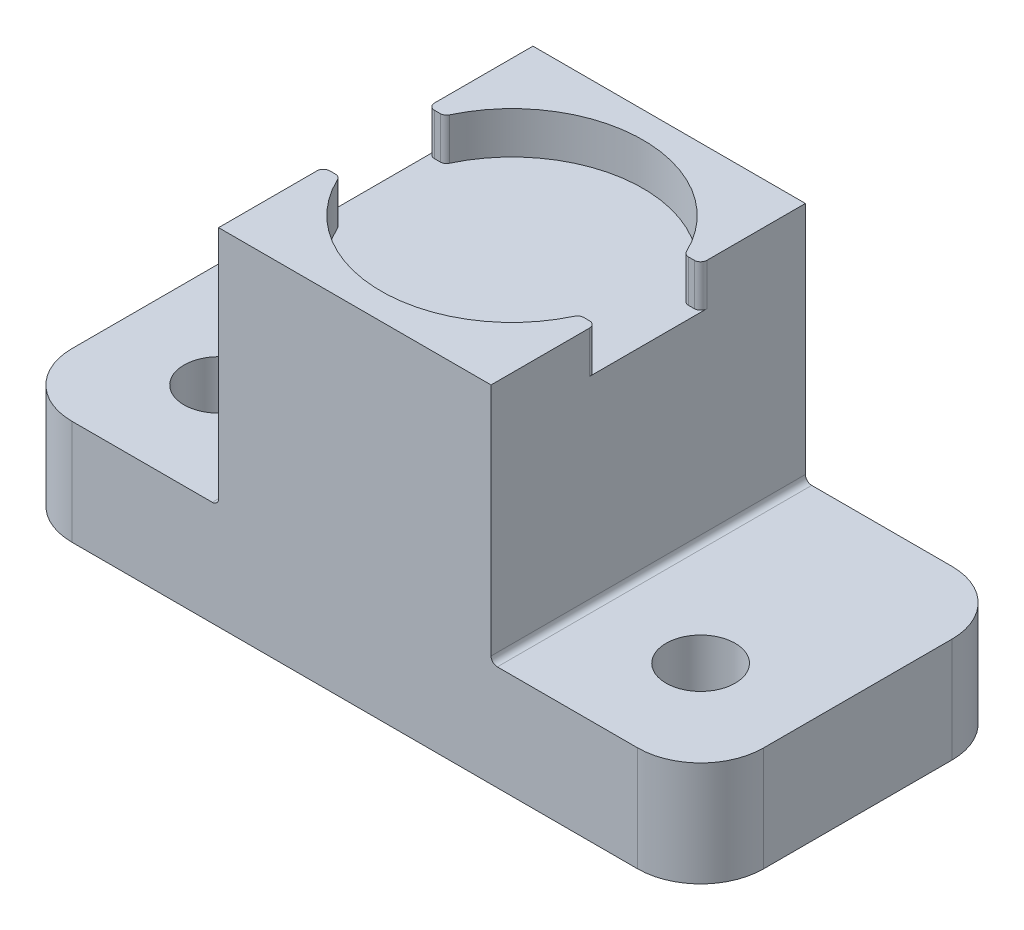
ISO-10303-21;
HEADER;
FILE_DESCRIPTION(('STEP AP214'),'2;1');
FILE_NAME('part.step','',(''),(''),'','','');
FILE_SCHEMA(('AUTOMOTIVE_DESIGN { 1 0 10303 214 1 1 1 1 }'));
ENDSEC;
DATA;
#1=APPLICATION_CONTEXT('core data for automotive mechanical design processes');
#2=APPLICATION_PROTOCOL_DEFINITION('international standard','automotive_design',2000,#1);
#3=PRODUCT_CONTEXT('',#1,'mechanical');
#4=PRODUCT('Part','Part','',(#3));
#5=PRODUCT_RELATED_PRODUCT_CATEGORY('part','',(#4));
#6=PRODUCT_DEFINITION_FORMATION('','',#4);
#7=PRODUCT_DEFINITION_CONTEXT('part definition',#1,'design');
#8=PRODUCT_DEFINITION('design','',#6,#7);
#9=PRODUCT_DEFINITION_SHAPE('','',#8);
#10=(LENGTH_UNIT() NAMED_UNIT(*) SI_UNIT(.MILLI.,.METRE.));
#11=(NAMED_UNIT(*) PLANE_ANGLE_UNIT() SI_UNIT($,.RADIAN.));
#12=(NAMED_UNIT(*) SI_UNIT($,.STERADIAN.) SOLID_ANGLE_UNIT());
#13=UNCERTAINTY_MEASURE_WITH_UNIT(LENGTH_MEASURE(1.E-05),#10,'distance_accuracy_value','');
#14=(GEOMETRIC_REPRESENTATION_CONTEXT(3) GLOBAL_UNCERTAINTY_ASSIGNED_CONTEXT((#13)) GLOBAL_UNIT_ASSIGNED_CONTEXT((#10,
#11,#12)) REPRESENTATION_CONTEXT('',''));
#15=CARTESIAN_POINT('',(0.,0.,0.));
#16=DIRECTION('',(0.,0.,1.));
#17=DIRECTION('',(1.,0.,0.));
#18=AXIS2_PLACEMENT_3D('',#15,#16,#17);
#19=CARTESIAN_POINT('',(0.,14.,15.));
#20=DIRECTION('',(0.,-1.,0.));
#21=DIRECTION('',(1.,0.,0.));
#22=AXIS2_PLACEMENT_3D('',#19,#20,#21);
#23=PLANE('',#22);
#24=DIRECTION('',(0.,0.,-1.));
#25=VECTOR('',#24,1.);
#26=CARTESIAN_POINT('',(6.50000000000001,14.,15.));
#27=LINE('',#26,#25);
#28=CARTESIAN_POINT('',(6.50000000000001,14.,15.));
#29=VERTEX_POINT('',#28);
#30=CARTESIAN_POINT('',(6.50000000000001,14.,10.3));
#31=VERTEX_POINT('',#30);
#32=EDGE_CURVE('E236',#29,#31,#27,.T.);
#33=ORIENTED_EDGE('',*,*,#32,.T.);
#34=CARTESIAN_POINT('',(6.20000000000001,14.,10.3));
#35=DIRECTION('',(0.,-1.,0.));
#36=DIRECTION('',(1.,0.,0.));
#37=AXIS2_PLACEMENT_3D('',#34,#35,#36);
#38=CIRCLE('',#37,0.3);
#39=CARTESIAN_POINT('',(6.20000000000001,14.,10.));
#40=VERTEX_POINT('',#39);
#41=EDGE_CURVE('E328',#31,#40,#38,.F.);
#42=ORIENTED_EDGE('',*,*,#41,.T.);
#43=DIRECTION('',(-1.,0.,0.));
#44=VECTOR('',#43,1.);
#45=CARTESIAN_POINT('',(0.,14.,10.));
#46=LINE('',#45,#44);
#47=CARTESIAN_POINT('',(5.92135964116352,14.,10.));
#48=VERTEX_POINT('',#47);
#49=EDGE_CURVE('E506',#40,#48,#46,.T.);
#50=ORIENTED_EDGE('',*,*,#49,.T.);
#51=CARTESIAN_POINT('',(5.92135964116352,14.,10.3));
#52=DIRECTION('',(0.,-1.,0.));
#53=DIRECTION('',(1.,0.,0.));
#54=AXIS2_PLACEMENT_3D('',#51,#52,#53);
#55=CIRCLE('',#54,0.3);
#56=CARTESIAN_POINT('',(5.6501523293545,14.,10.1717557251908));
#57=VERTEX_POINT('',#56);
#58=EDGE_CURVE('E326',#48,#57,#55,.F.);
#59=ORIENTED_EDGE('',*,*,#58,.T.);
#60=CARTESIAN_POINT('',(0.,14.,7.5));
#61=DIRECTION('',(0.,1.,0.));
#62=DIRECTION('',(-1.,0.,0.));
#63=AXIS2_PLACEMENT_3D('',#60,#61,#62);
#64=CIRCLE('',#63,6.25);
#65=CARTESIAN_POINT('',(-5.65015232935448,14.,10.1717557251908));
#66=VERTEX_POINT('',#65);
#67=EDGE_CURVE('E503',#66,#57,#64,.T.);
#68=ORIENTED_EDGE('',*,*,#67,.F.);
#69=CARTESIAN_POINT('',(-5.9213596411635,14.,10.3));
#70=DIRECTION('',(0.,-1.,0.));
#71=DIRECTION('',(1.,0.,0.));
#72=AXIS2_PLACEMENT_3D('',#69,#70,#71);
#73=CIRCLE('',#72,0.3);
#74=CARTESIAN_POINT('',(-5.9213596411635,14.,10.));
#75=VERTEX_POINT('',#74);
#76=EDGE_CURVE('E322',#66,#75,#73,.F.);
#77=ORIENTED_EDGE('',*,*,#76,.T.);
#78=DIRECTION('',(-1.,0.,0.));
#79=VECTOR('',#78,1.);
#80=CARTESIAN_POINT('',(0.,14.,10.));
#81=LINE('',#80,#79);
#82=CARTESIAN_POINT('',(-6.19999999999999,14.,10.));
#83=VERTEX_POINT('',#82);
#84=EDGE_CURVE('E500',#75,#83,#81,.T.);
#85=ORIENTED_EDGE('',*,*,#84,.T.);
#86=CARTESIAN_POINT('',(-6.19999999999999,14.,10.3));
#87=DIRECTION('',(0.,-1.,0.));
#88=DIRECTION('',(1.,0.,0.));
#89=AXIS2_PLACEMENT_3D('',#86,#87,#88);
#90=CIRCLE('',#89,0.3);
#91=CARTESIAN_POINT('',(-6.49999999999999,14.,10.3));
#92=VERTEX_POINT('',#91);
#93=EDGE_CURVE('E324',#83,#92,#90,.F.);
#94=ORIENTED_EDGE('',*,*,#93,.T.);
#95=DIRECTION('',(0.,0.,-1.));
#96=VECTOR('',#95,1.);
#97=CARTESIAN_POINT('',(-6.49999999999999,14.,15.));
#98=LINE('',#97,#96);
#99=CARTESIAN_POINT('',(-6.49999999999999,14.,15.));
#100=VERTEX_POINT('',#99);
#101=EDGE_CURVE('E252',#100,#92,#98,.T.);
#102=ORIENTED_EDGE('',*,*,#101,.F.);
#103=DIRECTION('',(-1.,0.,0.));
#104=VECTOR('',#103,1.);
#105=CARTESIAN_POINT('',(0.,14.,15.));
#106=LINE('',#105,#104);
#107=EDGE_CURVE('E250',#29,#100,#106,.T.);
#108=ORIENTED_EDGE('',*,*,#107,.F.);
#109=EDGE_LOOP('',(#33,#42,#50,#59,#68,#77,#85,#94,#102,#108));
#110=FACE_BOUND('',#109,.T.);
#111=ADVANCED_FACE('F38',(#110),#23,.F.);
#112=CARTESIAN_POINT('',(-6.49999999999999,0.,15.));
#113=DIRECTION('',(1.,0.,0.));
#114=DIRECTION('',(0.,1.,0.));
#115=AXIS2_PLACEMENT_3D('',#112,#113,#114);
#116=PLANE('',#115);
#117=DIRECTION('',(0.,-1.,0.));
#118=VECTOR('',#117,1.);
#119=CARTESIAN_POINT('',(-6.49999999999999,0.,0.));
#120=LINE('',#119,#118);
#121=CARTESIAN_POINT('',(-6.49999999999999,14.,0.));
#122=VERTEX_POINT('',#121);
#123=CARTESIAN_POINT('',(-6.49999999999999,2.8,0.));
#124=VERTEX_POINT('',#123);
#125=EDGE_CURVE('E284',#122,#124,#120,.T.);
#126=ORIENTED_EDGE('',*,*,#125,.T.);
#127=DIRECTION('',(0.,0.,-1.));
#128=VECTOR('',#127,1.);
#129=CARTESIAN_POINT('',(-6.49999999999999,2.8,15.));
#130=LINE('',#129,#128);
#131=CARTESIAN_POINT('',(-6.49999999999999,2.8,15.));
#132=VERTEX_POINT('',#131);
#133=EDGE_CURVE('E382',#124,#132,#130,.F.);
#134=ORIENTED_EDGE('',*,*,#133,.T.);
#135=DIRECTION('',(0.,-1.,0.));
#136=VECTOR('',#135,1.);
#137=CARTESIAN_POINT('',(-6.49999999999999,0.,15.));
#138=LINE('',#137,#136);
#139=EDGE_CURVE('E256',#100,#132,#138,.T.);
#140=ORIENTED_EDGE('',*,*,#139,.F.);
#141=ORIENTED_EDGE('',*,*,#101,.T.);
#142=DIRECTION('',(0.,1.,0.));
#143=VECTOR('',#142,1.);
#144=CARTESIAN_POINT('',(-6.49999999999999,12.,10.3));
#145=LINE('',#144,#143);
#146=CARTESIAN_POINT('',(-6.49999999999999,12.,10.3));
#147=VERTEX_POINT('',#146);
#148=EDGE_CURVE('E348',#92,#147,#145,.F.);
#149=ORIENTED_EDGE('',*,*,#148,.T.);
#150=DIRECTION('',(0.,0.,1.));
#151=VECTOR('',#150,1.);
#152=CARTESIAN_POINT('',(-6.49999999999999,12.,0.));
#153=LINE('',#152,#151);
#154=CARTESIAN_POINT('',(-6.49999999999999,12.,4.7));
#155=VERTEX_POINT('',#154);
#156=EDGE_CURVE('E848',#155,#147,#153,.T.);
#157=ORIENTED_EDGE('',*,*,#156,.F.);
#158=DIRECTION('',(0.,1.,0.));
#159=VECTOR('',#158,1.);
#160=CARTESIAN_POINT('',(-6.49999999999999,0.,4.7));
#161=LINE('',#160,#159);
#162=CARTESIAN_POINT('',(-6.49999999999999,14.,4.7));
#163=VERTEX_POINT('',#162);
#164=EDGE_CURVE('E345',#155,#163,#161,.T.);
#165=ORIENTED_EDGE('',*,*,#164,.T.);
#166=EDGE_CURVE('E299',#163,#122,#98,.T.);
#167=ORIENTED_EDGE('',*,*,#166,.T.);
#168=EDGE_LOOP('',(#126,#134,#140,#141,#149,#157,#165,#167));
#169=FACE_BOUND('',#168,.T.);
#170=ADVANCED_FACE('F529',(#169),#116,.F.);
#171=CARTESIAN_POINT('',(0.,2.5,15.));
#172=DIRECTION('',(0.,-1.,0.));
#173=DIRECTION('',(1.,0.,0.));
#174=AXIS2_PLACEMENT_3D('',#171,#172,#173);
#175=PLANE('',#174);
#176=CARTESIAN_POINT('',(11.5,2.5,9.99999999999998));
#177=DIRECTION('',(0.,1.,0.));
#178=DIRECTION('',(1.,0.,0.));
#179=AXIS2_PLACEMENT_3D('',#176,#177,#178);
#180=CIRCLE('',#179,1.65);
#181=CARTESIAN_POINT('',(13.15,2.5,9.99999999999998));
#182=VERTEX_POINT('',#181);
#183=EDGE_CURVE('E486',#182,#182,#180,.T.);
#184=ORIENTED_EDGE('',*,*,#183,.F.);
#185=EDGE_LOOP('',(#184));
#186=FACE_BOUND('',#185,.T.);
#187=DIRECTION('',(0.,0.,-1.));
#188=VECTOR('',#187,1.);
#189=CARTESIAN_POINT('',(16.5,2.5,15.));
#190=LINE('',#189,#188);
#191=CARTESIAN_POINT('',(16.5,2.5,12.));
#192=VERTEX_POINT('',#191);
#193=CARTESIAN_POINT('',(16.5,2.5,3.));
#194=VERTEX_POINT('',#193);
#195=EDGE_CURVE('E273',#192,#194,#190,.T.);
#196=ORIENTED_EDGE('',*,*,#195,.T.);
#197=CARTESIAN_POINT('',(13.5,2.5,3.));
#198=DIRECTION('',(0.,-1.,0.));
#199=DIRECTION('',(1.,0.,0.));
#200=AXIS2_PLACEMENT_3D('',#197,#198,#199);
#201=CIRCLE('',#200,3.);
#202=CARTESIAN_POINT('',(13.5,2.5,0.));
#203=VERTEX_POINT('',#202);
#204=EDGE_CURVE('E412',#194,#203,#201,.F.);
#205=ORIENTED_EDGE('',*,*,#204,.T.);
#206=DIRECTION('',(-1.,0.,0.));
#207=VECTOR('',#206,1.);
#208=CARTESIAN_POINT('',(0.,2.5,0.));
#209=LINE('',#208,#207);
#210=CARTESIAN_POINT('',(6.80000000000001,2.5,0.));
#211=VERTEX_POINT('',#210);
#212=EDGE_CURVE('E274',#203,#211,#209,.T.);
#213=ORIENTED_EDGE('',*,*,#212,.T.);
#214=DIRECTION('',(0.,0.,-1.));
#215=VECTOR('',#214,1.);
#216=CARTESIAN_POINT('',(6.80000000000001,2.5,15.));
#217=LINE('',#216,#215);
#218=CARTESIAN_POINT('',(6.80000000000001,2.5,15.));
#219=VERTEX_POINT('',#218);
#220=EDGE_CURVE('E376',#211,#219,#217,.F.);
#221=ORIENTED_EDGE('',*,*,#220,.T.);
#222=DIRECTION('',(-1.,0.,0.));
#223=VECTOR('',#222,1.);
#224=CARTESIAN_POINT('',(0.,2.5,15.));
#225=LINE('',#224,#223);
#226=CARTESIAN_POINT('',(13.5,2.5,15.));
#227=VERTEX_POINT('',#226);
#228=EDGE_CURVE('E262',#227,#219,#225,.T.);
#229=ORIENTED_EDGE('',*,*,#228,.F.);
#230=CARTESIAN_POINT('',(13.5,2.5,12.));
#231=DIRECTION('',(0.,-1.,0.));
#232=DIRECTION('',(1.,0.,0.));
#233=AXIS2_PLACEMENT_3D('',#230,#231,#232);
#234=CIRCLE('',#233,3.);
#235=EDGE_CURVE('E410',#227,#192,#234,.F.);
#236=ORIENTED_EDGE('',*,*,#235,.T.);
#237=EDGE_LOOP('',(#196,#205,#213,#221,#229,#236));
#238=FACE_BOUND('',#237,.T.);
#239=ADVANCED_FACE('F458',(#186,#238),#175,.F.);
#240=CARTESIAN_POINT('',(6.50000000000001,0.,15.));
#241=DIRECTION('',(1.,0.,0.));
#242=DIRECTION('',(0.,1.,0.));
#243=AXIS2_PLACEMENT_3D('',#240,#241,#242);
#244=PLANE('',#243);
#245=DIRECTION('',(0.,-1.,0.));
#246=VECTOR('',#245,1.);
#247=CARTESIAN_POINT('',(6.50000000000001,0.,15.));
#248=LINE('',#247,#246);
#249=CARTESIAN_POINT('',(6.50000000000001,2.8,15.));
#250=VERTEX_POINT('',#249);
#251=EDGE_CURVE('E241',#29,#250,#248,.T.);
#252=ORIENTED_EDGE('',*,*,#251,.T.);
#253=DIRECTION('',(0.,0.,-1.));
#254=VECTOR('',#253,1.);
#255=CARTESIAN_POINT('',(6.50000000000001,2.8,15.));
#256=LINE('',#255,#254);
#257=CARTESIAN_POINT('',(6.50000000000001,2.8,0.));
#258=VERTEX_POINT('',#257);
#259=EDGE_CURVE('E374',#250,#258,#256,.T.);
#260=ORIENTED_EDGE('',*,*,#259,.T.);
#261=DIRECTION('',(0.,-1.,0.));
#262=VECTOR('',#261,1.);
#263=CARTESIAN_POINT('',(6.50000000000001,0.,0.));
#264=LINE('',#263,#262);
#265=CARTESIAN_POINT('',(6.50000000000001,14.,0.));
#266=VERTEX_POINT('',#265);
#267=EDGE_CURVE('E276',#266,#258,#264,.T.);
#268=ORIENTED_EDGE('',*,*,#267,.F.);
#269=CARTESIAN_POINT('',(6.50000000000001,14.,4.7));
#270=VERTEX_POINT('',#269);
#271=EDGE_CURVE('E247',#270,#266,#27,.T.);
#272=ORIENTED_EDGE('',*,*,#271,.F.);
#273=DIRECTION('',(0.,1.,0.));
#274=VECTOR('',#273,1.);
#275=CARTESIAN_POINT('',(6.50000000000001,12.,4.7));
#276=LINE('',#275,#274);
#277=CARTESIAN_POINT('',(6.50000000000001,12.,4.7));
#278=VERTEX_POINT('',#277);
#279=EDGE_CURVE('E314',#270,#278,#276,.F.);
#280=ORIENTED_EDGE('',*,*,#279,.T.);
#281=DIRECTION('',(0.,0.,-1.));
#282=VECTOR('',#281,1.);
#283=CARTESIAN_POINT('',(6.50000000000001,12.,0.));
#284=LINE('',#283,#282);
#285=CARTESIAN_POINT('',(6.50000000000001,12.,10.3));
#286=VERTEX_POINT('',#285);
#287=EDGE_CURVE('E481',#286,#278,#284,.T.);
#288=ORIENTED_EDGE('',*,*,#287,.F.);
#289=DIRECTION('',(0.,1.,0.));
#290=VECTOR('',#289,1.);
#291=CARTESIAN_POINT('',(6.50000000000001,0.,10.3));
#292=LINE('',#291,#290);
#293=EDGE_CURVE('E244',#286,#31,#292,.T.);
#294=ORIENTED_EDGE('',*,*,#293,.T.);
#295=ORIENTED_EDGE('',*,*,#32,.F.);
#296=EDGE_LOOP('',(#252,#260,#268,#272,#280,#288,#294,#295));
#297=FACE_BOUND('',#296,.T.);
#298=ADVANCED_FACE('F238',(#297),#244,.T.);
#299=DIRECTION('',(-1.,0.,0.));
#300=VECTOR('',#299,1.);
#301=CARTESIAN_POINT('',(0.,14.,5.));
#302=LINE('',#301,#300);
#303=CARTESIAN_POINT('',(6.20000000000001,14.,5.));
#304=VERTEX_POINT('',#303);
#305=CARTESIAN_POINT('',(5.92135964116352,14.,5.));
#306=VERTEX_POINT('',#305);
#307=EDGE_CURVE('E509',#304,#306,#302,.T.);
#308=ORIENTED_EDGE('',*,*,#307,.F.);
#309=CARTESIAN_POINT('',(6.20000000000001,14.,4.7));
#310=DIRECTION('',(0.,-1.,0.));
#311=DIRECTION('',(1.,0.,0.));
#312=AXIS2_PLACEMENT_3D('',#309,#310,#311);
#313=CIRCLE('',#312,0.3);
#314=EDGE_CURVE('E311',#304,#270,#313,.F.);
#315=ORIENTED_EDGE('',*,*,#314,.T.);
#316=ORIENTED_EDGE('',*,*,#271,.T.);
#317=DIRECTION('',(-1.,0.,0.));
#318=VECTOR('',#317,1.);
#319=CARTESIAN_POINT('',(0.,14.,0.));
#320=LINE('',#319,#318);
#321=EDGE_CURVE('E281',#266,#122,#320,.T.);
#322=ORIENTED_EDGE('',*,*,#321,.T.);
#323=ORIENTED_EDGE('',*,*,#166,.F.);
#324=CARTESIAN_POINT('',(-6.19999999999999,14.,4.7));
#325=DIRECTION('',(0.,-1.,0.));
#326=DIRECTION('',(1.,0.,0.));
#327=AXIS2_PLACEMENT_3D('',#324,#325,#326);
#328=CIRCLE('',#327,0.3);
#329=CARTESIAN_POINT('',(-6.19999999999999,14.,5.));
#330=VERTEX_POINT('',#329);
#331=EDGE_CURVE('E307',#163,#330,#328,.F.);
#332=ORIENTED_EDGE('',*,*,#331,.T.);
#333=DIRECTION('',(-1.,0.,0.));
#334=VECTOR('',#333,1.);
#335=CARTESIAN_POINT('',(0.,14.,5.));
#336=LINE('',#335,#334);
#337=CARTESIAN_POINT('',(-5.9213596411635,14.,5.));
#338=VERTEX_POINT('',#337);
#339=EDGE_CURVE('E497',#338,#330,#336,.T.);
#340=ORIENTED_EDGE('',*,*,#339,.F.);
#341=CARTESIAN_POINT('',(-5.9213596411635,14.,4.7));
#342=DIRECTION('',(0.,-1.,0.));
#343=DIRECTION('',(1.,0.,0.));
#344=AXIS2_PLACEMENT_3D('',#341,#342,#343);
#345=CIRCLE('',#344,0.3);
#346=CARTESIAN_POINT('',(-5.65015232935448,14.,4.82824427480916));
#347=VERTEX_POINT('',#346);
#348=EDGE_CURVE('E305',#338,#347,#345,.F.);
#349=ORIENTED_EDGE('',*,*,#348,.T.);
#350=CARTESIAN_POINT('',(0.,14.,7.5));
#351=DIRECTION('',(0.,1.,0.));
#352=DIRECTION('',(-1.,0.,0.));
#353=AXIS2_PLACEMENT_3D('',#350,#351,#352);
#354=CIRCLE('',#353,6.25);
#355=CARTESIAN_POINT('',(5.6501523293545,14.,4.82824427480916));
#356=VERTEX_POINT('',#355);
#357=EDGE_CURVE('E494',#356,#347,#354,.T.);
#358=ORIENTED_EDGE('',*,*,#357,.F.);
#359=CARTESIAN_POINT('',(5.92135964116352,14.,4.7));
#360=DIRECTION('',(0.,-1.,0.));
#361=DIRECTION('',(1.,0.,0.));
#362=AXIS2_PLACEMENT_3D('',#359,#360,#361);
#363=CIRCLE('',#362,0.3);
#364=EDGE_CURVE('E309',#356,#306,#363,.F.);
#365=ORIENTED_EDGE('',*,*,#364,.T.);
#366=EDGE_LOOP('',(#308,#315,#316,#322,#323,#332,#340,#349,#358,#365));
#367=FACE_BOUND('',#366,.T.);
#368=ADVANCED_FACE('F469',(#367),#23,.F.);
#369=CARTESIAN_POINT('',(-11.5,2.5,10.));
#370=DIRECTION('',(0.,1.,0.));
#371=DIRECTION('',(-1.,0.,0.));
#372=AXIS2_PLACEMENT_3D('',#369,#370,#371);
#373=CIRCLE('',#372,1.65);
#374=CARTESIAN_POINT('',(-13.15,2.5,10.));
#375=VERTEX_POINT('',#374);
#376=EDGE_CURVE('E514',#375,#375,#373,.T.);
#377=ORIENTED_EDGE('',*,*,#376,.F.);
#378=EDGE_LOOP('',(#377));
#379=FACE_BOUND('',#378,.T.);
#380=CARTESIAN_POINT('',(-6.79999999999999,2.5,0.));
#381=VERTEX_POINT('',#380);
#382=CARTESIAN_POINT('',(-13.5,2.5,0.));
#383=VERTEX_POINT('',#382);
#384=EDGE_CURVE('E278',#381,#383,#209,.T.);
#385=ORIENTED_EDGE('',*,*,#384,.T.);
#386=CARTESIAN_POINT('',(-13.5,2.5,3.));
#387=DIRECTION('',(0.,-1.,0.));
#388=DIRECTION('',(1.,0.,0.));
#389=AXIS2_PLACEMENT_3D('',#386,#387,#388);
#390=CIRCLE('',#389,3.);
#391=CARTESIAN_POINT('',(-16.5,2.5,3.));
#392=VERTEX_POINT('',#391);
#393=EDGE_CURVE('E11',#383,#392,#390,.F.);
#394=ORIENTED_EDGE('',*,*,#393,.T.);
#395=DIRECTION('',(0.,0.,-1.));
#396=VECTOR('',#395,1.);
#397=CARTESIAN_POINT('',(-16.5,2.5,15.));
#398=LINE('',#397,#396);
#399=CARTESIAN_POINT('',(-16.5,2.5,12.));
#400=VERTEX_POINT('',#399);
#401=EDGE_CURVE('E297',#400,#392,#398,.T.);
#402=ORIENTED_EDGE('',*,*,#401,.F.);
#403=CARTESIAN_POINT('',(-13.5,2.5,12.));
#404=DIRECTION('',(0.,-1.,0.));
#405=DIRECTION('',(1.,0.,0.));
#406=AXIS2_PLACEMENT_3D('',#403,#404,#405);
#407=CIRCLE('',#406,3.);
#408=CARTESIAN_POINT('',(-13.5,2.5,15.));
#409=VERTEX_POINT('',#408);
#410=EDGE_CURVE('E46',#400,#409,#407,.F.);
#411=ORIENTED_EDGE('',*,*,#410,.T.);
#412=CARTESIAN_POINT('',(-6.79999999999999,2.5,15.));
#413=VERTEX_POINT('',#412);
#414=EDGE_CURVE('E266',#413,#409,#225,.T.);
#415=ORIENTED_EDGE('',*,*,#414,.F.);
#416=DIRECTION('',(0.,0.,-1.));
#417=VECTOR('',#416,1.);
#418=CARTESIAN_POINT('',(-6.79999999999999,2.5,0.));
#419=LINE('',#418,#417);
#420=EDGE_CURVE('E379',#413,#381,#419,.T.);
#421=ORIENTED_EDGE('',*,*,#420,.T.);
#422=EDGE_LOOP('',(#385,#394,#402,#411,#415,#421));
#423=FACE_BOUND('',#422,.T.);
#424=ADVANCED_FACE('F425',(#379,#423),#175,.F.);
#425=CARTESIAN_POINT('',(-16.5,0.,15.));
#426=DIRECTION('',(1.,0.,0.));
#427=DIRECTION('',(0.,0.,-1.));
#428=AXIS2_PLACEMENT_3D('',#425,#426,#427);
#429=PLANE('',#428);
#430=ORIENTED_EDGE('',*,*,#401,.T.);
#431=DIRECTION('',(0.,-1.,0.));
#432=VECTOR('',#431,1.);
#433=CARTESIAN_POINT('',(-16.5,0.,3.));
#434=LINE('',#433,#432);
#435=CARTESIAN_POINT('',(-16.5,-2.5,3.));
#436=VERTEX_POINT('',#435);
#437=EDGE_CURVE('E420',#392,#436,#434,.T.);
#438=ORIENTED_EDGE('',*,*,#437,.T.);
#439=DIRECTION('',(0.,0.,-1.));
#440=VECTOR('',#439,1.);
#441=CARTESIAN_POINT('',(-16.5,-2.5,15.));
#442=LINE('',#441,#440);
#443=CARTESIAN_POINT('',(-16.5,-2.5,12.));
#444=VERTEX_POINT('',#443);
#445=EDGE_CURVE('E294',#444,#436,#442,.T.);
#446=ORIENTED_EDGE('',*,*,#445,.F.);
#447=DIRECTION('',(0.,-1.,0.));
#448=VECTOR('',#447,1.);
#449=CARTESIAN_POINT('',(-16.5,2.5,12.));
#450=LINE('',#449,#448);
#451=EDGE_CURVE('E58',#444,#400,#450,.F.);
#452=ORIENTED_EDGE('',*,*,#451,.T.);
#453=EDGE_LOOP('',(#430,#438,#446,#452));
#454=FACE_BOUND('',#453,.T.);
#455=ADVANCED_FACE('F433',(#454),#429,.F.);
#456=CARTESIAN_POINT('',(0.,-2.5,15.));
#457=DIRECTION('',(0.,-1.,0.));
#458=DIRECTION('',(1.,0.,0.));
#459=AXIS2_PLACEMENT_3D('',#456,#457,#458);
#460=PLANE('',#459);
#461=CARTESIAN_POINT('',(-11.5,-2.50000000000001,10.));
#462=DIRECTION('',(0.,1.,0.));
#463=DIRECTION('',(-1.,0.,0.));
#464=AXIS2_PLACEMENT_3D('',#461,#462,#463);
#465=CIRCLE('',#464,1.65);
#466=CARTESIAN_POINT('',(-13.15,-2.50000000000001,10.));
#467=VERTEX_POINT('',#466);
#468=EDGE_CURVE('E277',#467,#467,#465,.T.);
#469=ORIENTED_EDGE('',*,*,#468,.T.);
#470=EDGE_LOOP('',(#469));
#471=FACE_BOUND('',#470,.T.);
#472=CARTESIAN_POINT('',(11.5,-2.5,9.99999999999998));
#473=DIRECTION('',(0.,1.,0.));
#474=DIRECTION('',(1.,0.,0.));
#475=AXIS2_PLACEMENT_3D('',#472,#473,#474);
#476=CIRCLE('',#475,1.65);
#477=CARTESIAN_POINT('',(13.15,-2.5,9.99999999999998));
#478=VERTEX_POINT('',#477);
#479=EDGE_CURVE('E489',#478,#478,#476,.T.);
#480=ORIENTED_EDGE('',*,*,#479,.T.);
#481=EDGE_LOOP('',(#480));
#482=FACE_BOUND('',#481,.T.);
#483=DIRECTION('',(-1.,0.,0.));
#484=VECTOR('',#483,1.);
#485=CARTESIAN_POINT('',(0.,-2.5,0.));
#486=LINE('',#485,#484);
#487=CARTESIAN_POINT('',(13.5,-2.5,0.));
#488=VERTEX_POINT('',#487);
#489=CARTESIAN_POINT('',(-13.5,-2.5,0.));
#490=VERTEX_POINT('',#489);
#491=EDGE_CURVE('E264',#488,#490,#486,.T.);
#492=ORIENTED_EDGE('',*,*,#491,.F.);
#493=CARTESIAN_POINT('',(13.5,-2.5,3.));
#494=DIRECTION('',(0.,-1.,0.));
#495=DIRECTION('',(1.,0.,0.));
#496=AXIS2_PLACEMENT_3D('',#493,#494,#495);
#497=CIRCLE('',#496,3.);
#498=CARTESIAN_POINT('',(16.5,-2.5,3.));
#499=VERTEX_POINT('',#498);
#500=EDGE_CURVE('E403',#488,#499,#497,.T.);
#501=ORIENTED_EDGE('',*,*,#500,.T.);
#502=DIRECTION('',(0.,0.,-1.));
#503=VECTOR('',#502,1.);
#504=CARTESIAN_POINT('',(16.5,-2.5,15.));
#505=LINE('',#504,#503);
#506=CARTESIAN_POINT('',(16.5,-2.5,12.));
#507=VERTEX_POINT('',#506);
#508=EDGE_CURVE('E291',#507,#499,#505,.T.);
#509=ORIENTED_EDGE('',*,*,#508,.F.);
#510=CARTESIAN_POINT('',(13.5,-2.5,12.));
#511=DIRECTION('',(0.,-1.,0.));
#512=DIRECTION('',(1.,0.,0.));
#513=AXIS2_PLACEMENT_3D('',#510,#511,#512);
#514=CIRCLE('',#513,3.);
#515=CARTESIAN_POINT('',(13.5,-2.5,15.));
#516=VERTEX_POINT('',#515);
#517=EDGE_CURVE('E401',#507,#516,#514,.T.);
#518=ORIENTED_EDGE('',*,*,#517,.T.);
#519=DIRECTION('',(-1.,0.,0.));
#520=VECTOR('',#519,1.);
#521=CARTESIAN_POINT('',(0.,-2.5,15.));
#522=LINE('',#521,#520);
#523=CARTESIAN_POINT('',(-13.5,-2.5,15.));
#524=VERTEX_POINT('',#523);
#525=EDGE_CURVE('E270',#516,#524,#522,.T.);
#526=ORIENTED_EDGE('',*,*,#525,.T.);
#527=CARTESIAN_POINT('',(-13.5,-2.5,12.));
#528=DIRECTION('',(0.,-1.,0.));
#529=DIRECTION('',(1.,0.,0.));
#530=AXIS2_PLACEMENT_3D('',#527,#528,#529);
#531=CIRCLE('',#530,3.);
#532=EDGE_CURVE('E397',#524,#444,#531,.T.);
#533=ORIENTED_EDGE('',*,*,#532,.T.);
#534=ORIENTED_EDGE('',*,*,#445,.T.);
#535=CARTESIAN_POINT('',(-13.5,-2.5,3.));
#536=DIRECTION('',(0.,-1.,0.));
#537=DIRECTION('',(1.,0.,0.));
#538=AXIS2_PLACEMENT_3D('',#535,#536,#537);
#539=CIRCLE('',#538,3.);
#540=EDGE_CURVE('E399',#436,#490,#539,.T.);
#541=ORIENTED_EDGE('',*,*,#540,.T.);
#542=EDGE_LOOP('',(#492,#501,#509,#518,#526,#533,#534,#541));
#543=FACE_BOUND('',#542,.T.);
#544=ADVANCED_FACE('F432',(#471,#482,#543),#460,.T.);
#545=CARTESIAN_POINT('',(16.5,0.,15.));
#546=DIRECTION('',(1.,0.,0.));
#547=DIRECTION('',(0.,0.,-1.));
#548=AXIS2_PLACEMENT_3D('',#545,#546,#547);
#549=PLANE('',#548);
#550=ORIENTED_EDGE('',*,*,#508,.T.);
#551=DIRECTION('',(0.,-1.,0.));
#552=VECTOR('',#551,1.);
#553=CARTESIAN_POINT('',(16.5,2.5,3.));
#554=LINE('',#553,#552);
#555=EDGE_CURVE('E408',#499,#194,#554,.F.);
#556=ORIENTED_EDGE('',*,*,#555,.T.);
#557=ORIENTED_EDGE('',*,*,#195,.F.);
#558=DIRECTION('',(0.,-1.,0.));
#559=VECTOR('',#558,1.);
#560=CARTESIAN_POINT('',(16.5,0.,12.));
#561=LINE('',#560,#559);
#562=EDGE_CURVE('E405',#192,#507,#561,.T.);
#563=ORIENTED_EDGE('',*,*,#562,.T.);
#564=EDGE_LOOP('',(#550,#556,#557,#563));
#565=FACE_BOUND('',#564,.T.);
#566=ADVANCED_FACE('F449',(#565),#549,.T.);
#567=CARTESIAN_POINT('',(0.,0.,15.));
#568=DIRECTION('',(0.,0.,1.));
#569=DIRECTION('',(1.,0.,0.));
#570=AXIS2_PLACEMENT_3D('',#567,#568,#569);
#571=PLANE('',#570);
#572=ORIENTED_EDGE('',*,*,#525,.F.);
#573=DIRECTION('',(0.,-1.,0.));
#574=VECTOR('',#573,1.);
#575=CARTESIAN_POINT('',(13.5,0.,15.));
#576=LINE('',#575,#574);
#577=EDGE_CURVE('E417',#516,#227,#576,.F.);
#578=ORIENTED_EDGE('',*,*,#577,.T.);
#579=ORIENTED_EDGE('',*,*,#228,.T.);
#580=CARTESIAN_POINT('',(6.80000000000001,2.8,15.));
#581=DIRECTION('',(0.,0.,1.));
#582=DIRECTION('',(1.,0.,0.));
#583=AXIS2_PLACEMENT_3D('',#580,#581,#582);
#584=CIRCLE('',#583,0.3);
#585=EDGE_CURVE('E261',#219,#250,#584,.F.);
#586=ORIENTED_EDGE('',*,*,#585,.T.);
#587=ORIENTED_EDGE('',*,*,#251,.F.);
#588=ORIENTED_EDGE('',*,*,#107,.T.);
#589=ORIENTED_EDGE('',*,*,#139,.T.);
#590=CARTESIAN_POINT('',(-6.79999999999999,2.8,15.));
#591=DIRECTION('',(0.,0.,1.));
#592=DIRECTION('',(1.,0.,0.));
#593=AXIS2_PLACEMENT_3D('',#590,#591,#592);
#594=CIRCLE('',#593,0.3);
#595=EDGE_CURVE('E390',#132,#413,#594,.F.);
#596=ORIENTED_EDGE('',*,*,#595,.T.);
#597=ORIENTED_EDGE('',*,*,#414,.T.);
#598=DIRECTION('',(0.,-1.,0.));
#599=VECTOR('',#598,1.);
#600=CARTESIAN_POINT('',(-13.5,-2.5,15.));
#601=LINE('',#600,#599);
#602=EDGE_CURVE('E414',#409,#524,#601,.T.);
#603=ORIENTED_EDGE('',*,*,#602,.T.);
#604=EDGE_LOOP('',(#572,#578,#579,#586,#587,#588,#589,#596,#597,#603));
#605=FACE_BOUND('',#604,.T.);
#606=ADVANCED_FACE('F259',(#605),#571,.T.);
#607=CARTESIAN_POINT('',(0.,0.,0.));
#608=DIRECTION('',(0.,0.,1.));
#609=DIRECTION('',(1.,0.,0.));
#610=AXIS2_PLACEMENT_3D('',#607,#608,#609);
#611=PLANE('',#610);
#612=ORIENTED_EDGE('',*,*,#212,.F.);
#613=DIRECTION('',(0.,-1.,0.));
#614=VECTOR('',#613,1.);
#615=CARTESIAN_POINT('',(13.5,-2.5,0.));
#616=LINE('',#615,#614);
#617=EDGE_CURVE('E394',#203,#488,#616,.T.);
#618=ORIENTED_EDGE('',*,*,#617,.T.);
#619=ORIENTED_EDGE('',*,*,#491,.T.);
#620=DIRECTION('',(0.,-1.,0.));
#621=VECTOR('',#620,1.);
#622=CARTESIAN_POINT('',(-13.5,0.,0.));
#623=LINE('',#622,#621);
#624=EDGE_CURVE('E392',#490,#383,#623,.F.);
#625=ORIENTED_EDGE('',*,*,#624,.T.);
#626=ORIENTED_EDGE('',*,*,#384,.F.);
#627=CARTESIAN_POINT('',(-6.79999999999999,2.8,0.));
#628=DIRECTION('',(0.,0.,1.));
#629=DIRECTION('',(1.,0.,0.));
#630=AXIS2_PLACEMENT_3D('',#627,#628,#629);
#631=CIRCLE('',#630,0.3);
#632=EDGE_CURVE('E388',#381,#124,#631,.T.);
#633=ORIENTED_EDGE('',*,*,#632,.T.);
#634=ORIENTED_EDGE('',*,*,#125,.F.);
#635=ORIENTED_EDGE('',*,*,#321,.F.);
#636=ORIENTED_EDGE('',*,*,#267,.T.);
#637=CARTESIAN_POINT('',(6.80000000000001,2.8,0.));
#638=DIRECTION('',(0.,0.,1.));
#639=DIRECTION('',(1.,0.,0.));
#640=AXIS2_PLACEMENT_3D('',#637,#638,#639);
#641=CIRCLE('',#640,0.3);
#642=EDGE_CURVE('E384',#258,#211,#641,.T.);
#643=ORIENTED_EDGE('',*,*,#642,.T.);
#644=EDGE_LOOP('',(#612,#618,#619,#625,#626,#633,#634,#635,#636,#643));
#645=FACE_BOUND('',#644,.T.);
#646=ADVANCED_FACE('F440',(#645),#611,.F.);
#647=CARTESIAN_POINT('',(11.5,-2.5,9.99999999999998));
#648=DIRECTION('',(0.,1.,0.));
#649=DIRECTION('',(-1.,0.,0.));
#650=AXIS2_PLACEMENT_3D('',#647,#648,#649);
#651=CYLINDRICAL_SURFACE('',#650,1.65);
#652=ORIENTED_EDGE('',*,*,#479,.F.);
#653=EDGE_LOOP('',(#652));
#654=FACE_BOUND('',#653,.T.);
#655=ORIENTED_EDGE('',*,*,#183,.T.);
#656=EDGE_LOOP('',(#655));
#657=FACE_BOUND('',#656,.T.);
#658=ADVANCED_FACE('F521',(#654,#657),#651,.F.);
#659=CARTESIAN_POINT('',(-11.5,-2.50000000000001,10.));
#660=DIRECTION('',(0.,1.,0.));
#661=DIRECTION('',(-1.,0.,0.));
#662=AXIS2_PLACEMENT_3D('',#659,#660,#661);
#663=CYLINDRICAL_SURFACE('',#662,1.65);
#664=ORIENTED_EDGE('',*,*,#468,.F.);
#665=EDGE_LOOP('',(#664));
#666=FACE_BOUND('',#665,.T.);
#667=ORIENTED_EDGE('',*,*,#376,.T.);
#668=EDGE_LOOP('',(#667));
#669=FACE_BOUND('',#668,.T.);
#670=ADVANCED_FACE('F524',(#666,#669),#663,.F.);
#671=CARTESIAN_POINT('',(0.,12.,7.5));
#672=DIRECTION('',(0.,1.,0.));
#673=DIRECTION('',(-1.,0.,0.));
#674=AXIS2_PLACEMENT_3D('',#671,#672,#673);
#675=CYLINDRICAL_SURFACE('',#674,6.25);
#676=CARTESIAN_POINT('',(0.,12.,7.5));
#677=DIRECTION('',(0.,1.,0.));
#678=DIRECTION('',(-1.,0.,0.));
#679=AXIS2_PLACEMENT_3D('',#676,#677,#678);
#680=CIRCLE('',#679,6.25);
#681=CARTESIAN_POINT('',(5.6501523293545,12.,4.82824427480916));
#682=VERTEX_POINT('',#681);
#683=CARTESIAN_POINT('',(-5.65015232935448,12.,4.82824427480916));
#684=VERTEX_POINT('',#683);
#685=EDGE_CURVE('E511',#682,#684,#680,.T.);
#686=ORIENTED_EDGE('',*,*,#685,.F.);
#687=DIRECTION('',(0.,1.,0.));
#688=VECTOR('',#687,1.);
#689=CARTESIAN_POINT('',(5.6501523293545,12.,4.82824427480916));
#690=LINE('',#689,#688);
#691=EDGE_CURVE('E319',#682,#356,#690,.T.);
#692=ORIENTED_EDGE('',*,*,#691,.T.);
#693=ORIENTED_EDGE('',*,*,#357,.T.);
#694=DIRECTION('',(0.,1.,0.));
#695=VECTOR('',#694,1.);
#696=CARTESIAN_POINT('',(-5.65015232935448,12.,4.82824427480916));
#697=LINE('',#696,#695);
#698=EDGE_CURVE('E317',#347,#684,#697,.F.);
#699=ORIENTED_EDGE('',*,*,#698,.T.);
#700=EDGE_LOOP('',(#686,#692,#693,#699));
#701=FACE_BOUND('',#700,.T.);
#702=ADVANCED_FACE('F596',(#701),#675,.F.);
#703=CARTESIAN_POINT('',(0.,12.,5.));
#704=DIRECTION('',(0.,0.,-1.));
#705=DIRECTION('',(-1.,0.,0.));
#706=AXIS2_PLACEMENT_3D('',#703,#704,#705);
#707=PLANE('',#706);
#708=DIRECTION('',(-1.,0.,0.));
#709=VECTOR('',#708,1.);
#710=CARTESIAN_POINT('',(0.,12.,5.));
#711=LINE('',#710,#709);
#712=CARTESIAN_POINT('',(6.20000000000001,12.,5.));
#713=VERTEX_POINT('',#712);
#714=CARTESIAN_POINT('',(5.92135964116352,12.,5.));
#715=VERTEX_POINT('',#714);
#716=EDGE_CURVE('E479',#713,#715,#711,.T.);
#717=ORIENTED_EDGE('',*,*,#716,.F.);
#718=DIRECTION('',(0.,1.,0.));
#719=VECTOR('',#718,1.);
#720=CARTESIAN_POINT('',(6.20000000000001,14.,5.));
#721=LINE('',#720,#719);
#722=EDGE_CURVE('E302',#713,#304,#721,.T.);
#723=ORIENTED_EDGE('',*,*,#722,.T.);
#724=ORIENTED_EDGE('',*,*,#307,.T.);
#725=DIRECTION('',(0.,1.,0.));
#726=VECTOR('',#725,1.);
#727=CARTESIAN_POINT('',(5.92135964116352,12.,5.));
#728=LINE('',#727,#726);
#729=EDGE_CURVE('E246',#306,#715,#728,.F.);
#730=ORIENTED_EDGE('',*,*,#729,.T.);
#731=EDGE_LOOP('',(#717,#723,#724,#730));
#732=FACE_BOUND('',#731,.T.);
#733=ADVANCED_FACE('F483',(#732),#707,.F.);
#734=CARTESIAN_POINT('',(0.,12.,10.));
#735=DIRECTION('',(0.,0.,-1.));
#736=DIRECTION('',(-1.,0.,0.));
#737=AXIS2_PLACEMENT_3D('',#734,#735,#736);
#738=PLANE('',#737);
#739=ORIENTED_EDGE('',*,*,#49,.F.);
#740=DIRECTION('',(0.,1.,0.));
#741=VECTOR('',#740,1.);
#742=CARTESIAN_POINT('',(6.20000000000001,12.,10.));
#743=LINE('',#742,#741);
#744=CARTESIAN_POINT('',(6.20000000000001,12.,10.));
#745=VERTEX_POINT('',#744);
#746=EDGE_CURVE('E333',#40,#745,#743,.F.);
#747=ORIENTED_EDGE('',*,*,#746,.T.);
#748=DIRECTION('',(-1.,0.,0.));
#749=VECTOR('',#748,1.);
#750=CARTESIAN_POINT('',(0.,12.,10.));
#751=LINE('',#750,#749);
#752=CARTESIAN_POINT('',(5.92135964116352,12.,10.));
#753=VERTEX_POINT('',#752);
#754=EDGE_CURVE('E490',#745,#753,#751,.T.);
#755=ORIENTED_EDGE('',*,*,#754,.T.);
#756=DIRECTION('',(0.,-1.,0.));
#757=VECTOR('',#756,1.);
#758=CARTESIAN_POINT('',(5.92135964116352,14.,10.));
#759=LINE('',#758,#757);
#760=EDGE_CURVE('E330',#753,#48,#759,.F.);
#761=ORIENTED_EDGE('',*,*,#760,.T.);
#762=EDGE_LOOP('',(#739,#747,#755,#761));
#763=FACE_BOUND('',#762,.T.);
#764=ADVANCED_FACE('F610',(#763),#738,.T.);
#765=CARTESIAN_POINT('',(0.,12.,7.5));
#766=DIRECTION('',(0.,1.,0.));
#767=DIRECTION('',(-1.,0.,0.));
#768=AXIS2_PLACEMENT_3D('',#765,#766,#767);
#769=CYLINDRICAL_SURFACE('',#768,6.25);
#770=ORIENTED_EDGE('',*,*,#67,.T.);
#771=DIRECTION('',(0.,1.,0.));
#772=VECTOR('',#771,1.);
#773=CARTESIAN_POINT('',(5.6501523293545,12.,10.1717557251908));
#774=LINE('',#773,#772);
#775=CARTESIAN_POINT('',(5.6501523293545,12.,10.1717557251908));
#776=VERTEX_POINT('',#775);
#777=EDGE_CURVE('E338',#57,#776,#774,.F.);
#778=ORIENTED_EDGE('',*,*,#777,.T.);
#779=CARTESIAN_POINT('',(0.,12.,7.5));
#780=DIRECTION('',(0.,1.,0.));
#781=DIRECTION('',(-1.,0.,0.));
#782=AXIS2_PLACEMENT_3D('',#779,#780,#781);
#783=CIRCLE('',#782,6.25);
#784=CARTESIAN_POINT('',(-5.65015232935448,12.,10.1717557251908));
#785=VERTEX_POINT('',#784);
#786=EDGE_CURVE('E869',#785,#776,#783,.T.);
#787=ORIENTED_EDGE('',*,*,#786,.F.);
#788=DIRECTION('',(0.,1.,0.));
#789=VECTOR('',#788,1.);
#790=CARTESIAN_POINT('',(-5.65015232935448,12.,10.1717557251908));
#791=LINE('',#790,#789);
#792=EDGE_CURVE('E335',#785,#66,#791,.T.);
#793=ORIENTED_EDGE('',*,*,#792,.T.);
#794=EDGE_LOOP('',(#770,#778,#787,#793));
#795=FACE_BOUND('',#794,.T.);
#796=ADVANCED_FACE('F617',(#795),#769,.F.);
#797=CARTESIAN_POINT('',(0.,12.,10.));
#798=DIRECTION('',(0.,0.,-1.));
#799=DIRECTION('',(-1.,0.,0.));
#800=AXIS2_PLACEMENT_3D('',#797,#798,#799);
#801=PLANE('',#800);
#802=DIRECTION('',(-1.,0.,0.));
#803=VECTOR('',#802,1.);
#804=CARTESIAN_POINT('',(0.,12.,10.));
#805=LINE('',#804,#803);
#806=CARTESIAN_POINT('',(-5.9213596411635,12.,10.));
#807=VERTEX_POINT('',#806);
#808=CARTESIAN_POINT('',(-6.19999999999999,12.,10.));
#809=VERTEX_POINT('',#808);
#810=EDGE_CURVE('E866',#807,#809,#805,.T.);
#811=ORIENTED_EDGE('',*,*,#810,.T.);
#812=DIRECTION('',(0.,1.,0.));
#813=VECTOR('',#812,1.);
#814=CARTESIAN_POINT('',(-6.19999999999999,14.,10.));
#815=LINE('',#814,#813);
#816=EDGE_CURVE('E342',#809,#83,#815,.T.);
#817=ORIENTED_EDGE('',*,*,#816,.T.);
#818=ORIENTED_EDGE('',*,*,#84,.F.);
#819=DIRECTION('',(0.,-1.,0.));
#820=VECTOR('',#819,1.);
#821=CARTESIAN_POINT('',(-5.9213596411635,12.,10.));
#822=LINE('',#821,#820);
#823=EDGE_CURVE('E340',#75,#807,#822,.T.);
#824=ORIENTED_EDGE('',*,*,#823,.T.);
#825=EDGE_LOOP('',(#811,#817,#818,#824));
#826=FACE_BOUND('',#825,.T.);
#827=ADVANCED_FACE('F625',(#826),#801,.T.);
#828=CARTESIAN_POINT('',(0.,12.,5.));
#829=DIRECTION('',(0.,0.,-1.));
#830=DIRECTION('',(-1.,0.,0.));
#831=AXIS2_PLACEMENT_3D('',#828,#829,#830);
#832=PLANE('',#831);
#833=ORIENTED_EDGE('',*,*,#339,.T.);
#834=DIRECTION('',(0.,1.,0.));
#835=VECTOR('',#834,1.);
#836=CARTESIAN_POINT('',(-6.19999999999999,12.,5.));
#837=LINE('',#836,#835);
#838=CARTESIAN_POINT('',(-6.19999999999999,12.,5.));
#839=VERTEX_POINT('',#838);
#840=EDGE_CURVE('E354',#330,#839,#837,.F.);
#841=ORIENTED_EDGE('',*,*,#840,.T.);
#842=DIRECTION('',(-1.,0.,0.));
#843=VECTOR('',#842,1.);
#844=CARTESIAN_POINT('',(0.,12.,5.));
#845=LINE('',#844,#843);
#846=CARTESIAN_POINT('',(-5.9213596411635,12.,5.));
#847=VERTEX_POINT('',#846);
#848=EDGE_CURVE('E855',#847,#839,#845,.T.);
#849=ORIENTED_EDGE('',*,*,#848,.F.);
#850=DIRECTION('',(0.,1.,0.));
#851=VECTOR('',#850,1.);
#852=CARTESIAN_POINT('',(-5.9213596411635,12.,5.));
#853=LINE('',#852,#851);
#854=EDGE_CURVE('E351',#847,#338,#853,.T.);
#855=ORIENTED_EDGE('',*,*,#854,.T.);
#856=EDGE_LOOP('',(#833,#841,#849,#855));
#857=FACE_BOUND('',#856,.T.);
#858=ADVANCED_FACE('F633',(#857),#832,.F.);
#859=CARTESIAN_POINT('',(0.,12.,0.));
#860=DIRECTION('',(0.,1.,0.));
#861=DIRECTION('',(-1.,0.,0.));
#862=AXIS2_PLACEMENT_3D('',#859,#860,#861);
#863=PLANE('',#862);
#864=ORIENTED_EDGE('',*,*,#716,.T.);
#865=CARTESIAN_POINT('',(5.92135964116352,12.,4.7));
#866=DIRECTION('',(0.,1.,0.));
#867=DIRECTION('',(-1.,0.,0.));
#868=AXIS2_PLACEMENT_3D('',#865,#866,#867);
#869=CIRCLE('',#868,0.3);
#870=EDGE_CURVE('E358',#715,#682,#869,.F.);
#871=ORIENTED_EDGE('',*,*,#870,.T.);
#872=ORIENTED_EDGE('',*,*,#685,.T.);
#873=CARTESIAN_POINT('',(-5.9213596411635,12.,4.7));
#874=DIRECTION('',(0.,1.,0.));
#875=DIRECTION('',(-1.,0.,0.));
#876=AXIS2_PLACEMENT_3D('',#873,#874,#875);
#877=CIRCLE('',#876,0.3);
#878=EDGE_CURVE('E372',#684,#847,#877,.F.);
#879=ORIENTED_EDGE('',*,*,#878,.T.);
#880=ORIENTED_EDGE('',*,*,#848,.T.);
#881=CARTESIAN_POINT('',(-6.19999999999999,12.,4.7));
#882=DIRECTION('',(0.,1.,0.));
#883=DIRECTION('',(-1.,0.,0.));
#884=AXIS2_PLACEMENT_3D('',#881,#882,#883);
#885=CIRCLE('',#884,0.3);
#886=EDGE_CURVE('E369',#839,#155,#885,.F.);
#887=ORIENTED_EDGE('',*,*,#886,.T.);
#888=ORIENTED_EDGE('',*,*,#156,.T.);
#889=CARTESIAN_POINT('',(-6.19999999999999,12.,10.3));
#890=DIRECTION('',(0.,1.,0.));
#891=DIRECTION('',(-1.,0.,0.));
#892=AXIS2_PLACEMENT_3D('',#889,#890,#891);
#893=CIRCLE('',#892,0.3);
#894=EDGE_CURVE('E365',#147,#809,#893,.F.);
#895=ORIENTED_EDGE('',*,*,#894,.T.);
#896=ORIENTED_EDGE('',*,*,#810,.F.);
#897=CARTESIAN_POINT('',(-5.9213596411635,12.,10.3));
#898=DIRECTION('',(0.,1.,0.));
#899=DIRECTION('',(-1.,0.,0.));
#900=AXIS2_PLACEMENT_3D('',#897,#898,#899);
#901=CIRCLE('',#900,0.3);
#902=EDGE_CURVE('E367',#807,#785,#901,.F.);
#903=ORIENTED_EDGE('',*,*,#902,.T.);
#904=ORIENTED_EDGE('',*,*,#786,.T.);
#905=CARTESIAN_POINT('',(5.92135964116352,12.,10.3));
#906=DIRECTION('',(0.,1.,0.));
#907=DIRECTION('',(-1.,0.,0.));
#908=AXIS2_PLACEMENT_3D('',#905,#906,#907);
#909=CIRCLE('',#908,0.3);
#910=EDGE_CURVE('E363',#776,#753,#909,.F.);
#911=ORIENTED_EDGE('',*,*,#910,.T.);
#912=ORIENTED_EDGE('',*,*,#754,.F.);
#913=CARTESIAN_POINT('',(6.20000000000001,12.,10.3));
#914=DIRECTION('',(0.,1.,0.));
#915=DIRECTION('',(-1.,0.,0.));
#916=AXIS2_PLACEMENT_3D('',#913,#914,#915);
#917=CIRCLE('',#916,0.3);
#918=EDGE_CURVE('E360',#745,#286,#917,.F.);
#919=ORIENTED_EDGE('',*,*,#918,.T.);
#920=ORIENTED_EDGE('',*,*,#287,.T.);
#921=CARTESIAN_POINT('',(6.20000000000001,12.,4.7));
#922=DIRECTION('',(0.,1.,0.));
#923=DIRECTION('',(-1.,0.,0.));
#924=AXIS2_PLACEMENT_3D('',#921,#922,#923);
#925=CIRCLE('',#924,0.3);
#926=EDGE_CURVE('E356',#278,#713,#925,.F.);
#927=ORIENTED_EDGE('',*,*,#926,.T.);
#928=EDGE_LOOP('',(#864,#871,#872,#879,#880,#887,#888,#895,#896,#903,#904,#911,#912,#919,#920,#927));
#929=FACE_BOUND('',#928,.T.);
#930=ADVANCED_FACE('F478',(#929),#863,.T.);
#931=CARTESIAN_POINT('',(6.20000000000001,12.,4.7));
#932=DIRECTION('',(0.,-1.,0.));
#933=DIRECTION('',(1.,0.,0.));
#934=AXIS2_PLACEMENT_3D('',#931,#932,#933);
#935=CYLINDRICAL_SURFACE('',#934,0.3);
#936=ORIENTED_EDGE('',*,*,#926,.F.);
#937=ORIENTED_EDGE('',*,*,#279,.F.);
#938=ORIENTED_EDGE('',*,*,#314,.F.);
#939=ORIENTED_EDGE('',*,*,#722,.F.);
#940=EDGE_LOOP('',(#936,#937,#938,#939));
#941=FACE_BOUND('',#940,.T.);
#942=ADVANCED_FACE('F473',(#941),#935,.T.);
#943=CARTESIAN_POINT('',(5.92135964116352,12.,4.7));
#944=DIRECTION('',(0.,1.,0.));
#945=DIRECTION('',(-1.,0.,0.));
#946=AXIS2_PLACEMENT_3D('',#943,#944,#945);
#947=CYLINDRICAL_SURFACE('',#946,0.3);
#948=ORIENTED_EDGE('',*,*,#870,.F.);
#949=ORIENTED_EDGE('',*,*,#729,.F.);
#950=ORIENTED_EDGE('',*,*,#364,.F.);
#951=ORIENTED_EDGE('',*,*,#691,.F.);
#952=EDGE_LOOP('',(#948,#949,#950,#951));
#953=FACE_BOUND('',#952,.T.);
#954=ADVANCED_FACE('F654',(#953),#947,.T.);
#955=CARTESIAN_POINT('',(6.20000000000001,0.,10.3));
#956=DIRECTION('',(0.,1.,0.));
#957=DIRECTION('',(-1.,0.,0.));
#958=AXIS2_PLACEMENT_3D('',#955,#956,#957);
#959=CYLINDRICAL_SURFACE('',#958,0.3);
#960=ORIENTED_EDGE('',*,*,#918,.F.);
#961=ORIENTED_EDGE('',*,*,#746,.F.);
#962=ORIENTED_EDGE('',*,*,#41,.F.);
#963=ORIENTED_EDGE('',*,*,#293,.F.);
#964=EDGE_LOOP('',(#960,#961,#962,#963));
#965=FACE_BOUND('',#964,.T.);
#966=ADVANCED_FACE('F661',(#965),#959,.T.);
#967=CARTESIAN_POINT('',(5.92135964116352,12.,10.3));
#968=DIRECTION('',(0.,1.,0.));
#969=DIRECTION('',(-1.,0.,0.));
#970=AXIS2_PLACEMENT_3D('',#967,#968,#969);
#971=CYLINDRICAL_SURFACE('',#970,0.3);
#972=ORIENTED_EDGE('',*,*,#910,.F.);
#973=ORIENTED_EDGE('',*,*,#777,.F.);
#974=ORIENTED_EDGE('',*,*,#58,.F.);
#975=ORIENTED_EDGE('',*,*,#760,.F.);
#976=EDGE_LOOP('',(#972,#973,#974,#975));
#977=FACE_BOUND('',#976,.T.);
#978=ADVANCED_FACE('F669',(#977),#971,.T.);
#979=CARTESIAN_POINT('',(-6.19999999999999,12.,10.3));
#980=DIRECTION('',(0.,-1.,0.));
#981=DIRECTION('',(1.,0.,0.));
#982=AXIS2_PLACEMENT_3D('',#979,#980,#981);
#983=CYLINDRICAL_SURFACE('',#982,0.3);
#984=ORIENTED_EDGE('',*,*,#894,.F.);
#985=ORIENTED_EDGE('',*,*,#148,.F.);
#986=ORIENTED_EDGE('',*,*,#93,.F.);
#987=ORIENTED_EDGE('',*,*,#816,.F.);
#988=EDGE_LOOP('',(#984,#985,#986,#987));
#989=FACE_BOUND('',#988,.T.);
#990=ADVANCED_FACE('F677',(#989),#983,.T.);
#991=CARTESIAN_POINT('',(-5.9213596411635,12.,10.3));
#992=DIRECTION('',(0.,1.,0.));
#993=DIRECTION('',(-1.,0.,0.));
#994=AXIS2_PLACEMENT_3D('',#991,#992,#993);
#995=CYLINDRICAL_SURFACE('',#994,0.3);
#996=ORIENTED_EDGE('',*,*,#902,.F.);
#997=ORIENTED_EDGE('',*,*,#823,.F.);
#998=ORIENTED_EDGE('',*,*,#76,.F.);
#999=ORIENTED_EDGE('',*,*,#792,.F.);
#1000=EDGE_LOOP('',(#996,#997,#998,#999));
#1001=FACE_BOUND('',#1000,.T.);
#1002=ADVANCED_FACE('F685',(#1001),#995,.T.);
#1003=CARTESIAN_POINT('',(-6.19999999999999,0.,4.7));
#1004=DIRECTION('',(0.,1.,0.));
#1005=DIRECTION('',(-1.,0.,0.));
#1006=AXIS2_PLACEMENT_3D('',#1003,#1004,#1005);
#1007=CYLINDRICAL_SURFACE('',#1006,0.3);
#1008=ORIENTED_EDGE('',*,*,#886,.F.);
#1009=ORIENTED_EDGE('',*,*,#840,.F.);
#1010=ORIENTED_EDGE('',*,*,#331,.F.);
#1011=ORIENTED_EDGE('',*,*,#164,.F.);
#1012=EDGE_LOOP('',(#1008,#1009,#1010,#1011));
#1013=FACE_BOUND('',#1012,.T.);
#1014=ADVANCED_FACE('F693',(#1013),#1007,.T.);
#1015=CARTESIAN_POINT('',(-5.9213596411635,12.,4.7));
#1016=DIRECTION('',(0.,1.,0.));
#1017=DIRECTION('',(-1.,0.,0.));
#1018=AXIS2_PLACEMENT_3D('',#1015,#1016,#1017);
#1019=CYLINDRICAL_SURFACE('',#1018,0.3);
#1020=ORIENTED_EDGE('',*,*,#878,.F.);
#1021=ORIENTED_EDGE('',*,*,#698,.F.);
#1022=ORIENTED_EDGE('',*,*,#348,.F.);
#1023=ORIENTED_EDGE('',*,*,#854,.F.);
#1024=EDGE_LOOP('',(#1020,#1021,#1022,#1023));
#1025=FACE_BOUND('',#1024,.T.);
#1026=ADVANCED_FACE('F701',(#1025),#1019,.T.);
#1027=CARTESIAN_POINT('',(6.80000000000001,2.8,15.));
#1028=DIRECTION('',(0.,0.,-1.));
#1029=DIRECTION('',(-1.,0.,0.));
#1030=AXIS2_PLACEMENT_3D('',#1027,#1028,#1029);
#1031=CYLINDRICAL_SURFACE('',#1030,0.3);
#1032=ORIENTED_EDGE('',*,*,#585,.F.);
#1033=ORIENTED_EDGE('',*,*,#220,.F.);
#1034=ORIENTED_EDGE('',*,*,#642,.F.);
#1035=ORIENTED_EDGE('',*,*,#259,.F.);
#1036=EDGE_LOOP('',(#1032,#1033,#1034,#1035));
#1037=FACE_BOUND('',#1036,.T.);
#1038=ADVANCED_FACE('F461',(#1037),#1031,.F.);
#1039=CARTESIAN_POINT('',(-6.79999999999999,2.8,15.));
#1040=DIRECTION('',(0.,0.,1.));
#1041=DIRECTION('',(1.,0.,0.));
#1042=AXIS2_PLACEMENT_3D('',#1039,#1040,#1041);
#1043=CYLINDRICAL_SURFACE('',#1042,0.3);
#1044=ORIENTED_EDGE('',*,*,#595,.F.);
#1045=ORIENTED_EDGE('',*,*,#133,.F.);
#1046=ORIENTED_EDGE('',*,*,#632,.F.);
#1047=ORIENTED_EDGE('',*,*,#420,.F.);
#1048=EDGE_LOOP('',(#1044,#1045,#1046,#1047));
#1049=FACE_BOUND('',#1048,.T.);
#1050=ADVANCED_FACE('F717',(#1049),#1043,.F.);
#1051=CARTESIAN_POINT('',(13.5,0.,3.));
#1052=DIRECTION('',(0.,1.,0.));
#1053=DIRECTION('',(0.,0.,1.));
#1054=AXIS2_PLACEMENT_3D('',#1051,#1052,#1053);
#1055=CYLINDRICAL_SURFACE('',#1054,3.);
#1056=ORIENTED_EDGE('',*,*,#204,.F.);
#1057=ORIENTED_EDGE('',*,*,#555,.F.);
#1058=ORIENTED_EDGE('',*,*,#500,.F.);
#1059=ORIENTED_EDGE('',*,*,#617,.F.);
#1060=EDGE_LOOP('',(#1056,#1057,#1058,#1059));
#1061=FACE_BOUND('',#1060,.T.);
#1062=ADVANCED_FACE('F445',(#1061),#1055,.T.);
#1063=CARTESIAN_POINT('',(13.5,0.,12.));
#1064=DIRECTION('',(0.,-1.,0.));
#1065=DIRECTION('',(0.,0.,-1.));
#1066=AXIS2_PLACEMENT_3D('',#1063,#1064,#1065);
#1067=CYLINDRICAL_SURFACE('',#1066,3.);
#1068=ORIENTED_EDGE('',*,*,#235,.F.);
#1069=ORIENTED_EDGE('',*,*,#577,.F.);
#1070=ORIENTED_EDGE('',*,*,#517,.F.);
#1071=ORIENTED_EDGE('',*,*,#562,.F.);
#1072=EDGE_LOOP('',(#1068,#1069,#1070,#1071));
#1073=FACE_BOUND('',#1072,.T.);
#1074=ADVANCED_FACE('F454',(#1073),#1067,.T.);
#1075=CARTESIAN_POINT('',(-13.5,0.,3.));
#1076=DIRECTION('',(0.,-1.,0.));
#1077=DIRECTION('',(0.,0.,-1.));
#1078=AXIS2_PLACEMENT_3D('',#1075,#1076,#1077);
#1079=CYLINDRICAL_SURFACE('',#1078,3.);
#1080=ORIENTED_EDGE('',*,*,#393,.F.);
#1081=ORIENTED_EDGE('',*,*,#624,.F.);
#1082=ORIENTED_EDGE('',*,*,#540,.F.);
#1083=ORIENTED_EDGE('',*,*,#437,.F.);
#1084=EDGE_LOOP('',(#1080,#1081,#1082,#1083));
#1085=FACE_BOUND('',#1084,.T.);
#1086=ADVANCED_FACE('F436',(#1085),#1079,.T.);
#1087=CARTESIAN_POINT('',(-13.5,0.,12.));
#1088=DIRECTION('',(0.,1.,0.));
#1089=DIRECTION('',(0.,0.,1.));
#1090=AXIS2_PLACEMENT_3D('',#1087,#1088,#1089);
#1091=CYLINDRICAL_SURFACE('',#1090,3.);
#1092=ORIENTED_EDGE('',*,*,#410,.F.);
#1093=ORIENTED_EDGE('',*,*,#451,.F.);
#1094=ORIENTED_EDGE('',*,*,#532,.F.);
#1095=ORIENTED_EDGE('',*,*,#602,.F.);
#1096=EDGE_LOOP('',(#1092,#1093,#1094,#1095));
#1097=FACE_BOUND('',#1096,.T.);
#1098=ADVANCED_FACE('F40',(#1097),#1091,.T.);
#1099=CLOSED_SHELL('',(#111,#170,#239,#298,#368,#424,#455,#544,#566,#606,#646,#658,#670,#702,
#733,#764,#796,#827,#858,#930,#942,#954,#966,#978,#990,#1002,#1014,#1026,#1038,#1050,#1062,
#1074,#1086,#1098));
#1100=MANIFOLD_SOLID_BREP('B2',#1099);
#1101=ADVANCED_BREP_SHAPE_REPRESENTATION('',(#18,#1100),#14);
#1102=SHAPE_DEFINITION_REPRESENTATION(#9,#1101);
ENDSEC;
END-ISO-10303-21;
